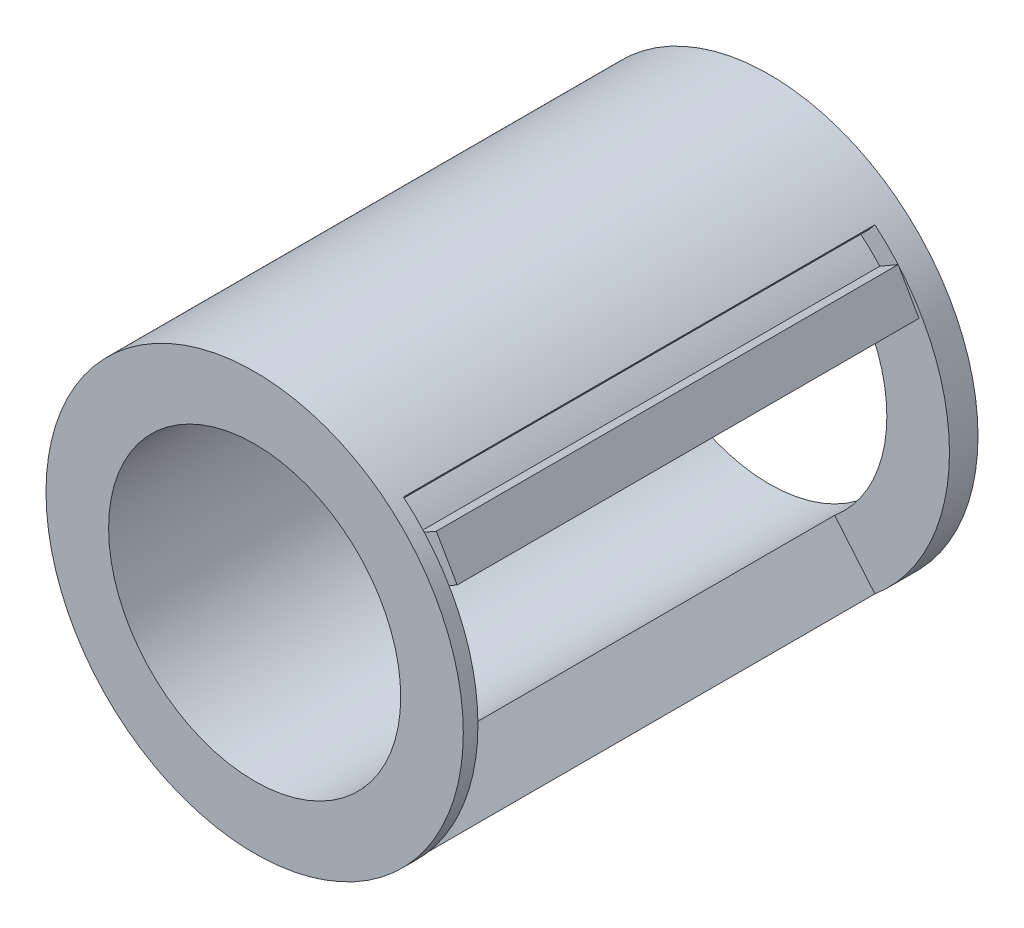
ISO-10303-21;
HEADER;
FILE_DESCRIPTION(('STEP AP214'),'2;1');
FILE_NAME('part.step','',(''),(''),'','','');
FILE_SCHEMA(('AUTOMOTIVE_DESIGN { 1 0 10303 214 1 1 1 1 }'));
ENDSEC;
DATA;
#1=APPLICATION_CONTEXT('core data for automotive mechanical design processes');
#2=APPLICATION_PROTOCOL_DEFINITION('international standard','automotive_design',2000,#1);
#3=PRODUCT_CONTEXT('',#1,'mechanical');
#4=PRODUCT('Part','Part','',(#3));
#5=PRODUCT_RELATED_PRODUCT_CATEGORY('part','',(#4));
#6=PRODUCT_DEFINITION_FORMATION('','',#4);
#7=PRODUCT_DEFINITION_CONTEXT('part definition',#1,'design');
#8=PRODUCT_DEFINITION('design','',#6,#7);
#9=PRODUCT_DEFINITION_SHAPE('','',#8);
#10=(LENGTH_UNIT() NAMED_UNIT(*) SI_UNIT(.MILLI.,.METRE.));
#11=(NAMED_UNIT(*) PLANE_ANGLE_UNIT() SI_UNIT($,.RADIAN.));
#12=(NAMED_UNIT(*) SI_UNIT($,.STERADIAN.) SOLID_ANGLE_UNIT());
#13=UNCERTAINTY_MEASURE_WITH_UNIT(LENGTH_MEASURE(1.E-05),#10,'distance_accuracy_value','');
#14=(GEOMETRIC_REPRESENTATION_CONTEXT(3) GLOBAL_UNCERTAINTY_ASSIGNED_CONTEXT((#13)) GLOBAL_UNIT_ASSIGNED_CONTEXT((#10,
#11,#12)) REPRESENTATION_CONTEXT('',''));
#15=CARTESIAN_POINT('',(0.,0.,0.));
#16=DIRECTION('',(0.,0.,1.));
#17=DIRECTION('',(1.,0.,0.));
#18=AXIS2_PLACEMENT_3D('',#15,#16,#17);
#19=CARTESIAN_POINT('',(0.,0.,100.));
#20=DIRECTION('',(0.,0.,1.));
#21=DIRECTION('',(1.,0.,0.));
#22=AXIS2_PLACEMENT_3D('',#19,#20,#21);
#23=CYLINDRICAL_SURFACE('',#22,14.);
#24=DIRECTION('',(0.,0.,1.));
#25=VECTOR('',#24,1.);
#26=CARTESIAN_POINT('',(10.3427192823264,9.43547337694269,100.));
#27=LINE('',#26,#25);
#28=CARTESIAN_POINT('',(10.3427192823266,9.43547337694242,59.4));
#29=VERTEX_POINT('',#28);
#30=CARTESIAN_POINT('',(10.3427192823264,9.43547337694264,92.6));
#31=VERTEX_POINT('',#30);
#32=EDGE_CURVE('E129',#29,#31,#27,.T.);
#33=ORIENTED_EDGE('',*,*,#32,.F.);
#34=CARTESIAN_POINT('',(0.,0.,59.4));
#35=DIRECTION('',(0.,0.,1.));
#36=DIRECTION('',(1.,0.,0.));
#37=AXIS2_PLACEMENT_3D('',#34,#35,#36);
#38=CIRCLE('',#37,14.);
#39=CARTESIAN_POINT('',(-10.7246222036657,8.9990265356115,59.4));
#40=VERTEX_POINT('',#39);
#41=EDGE_CURVE('E146',#29,#40,#38,.T.);
#42=ORIENTED_EDGE('',*,*,#41,.T.);
#43=DIRECTION('',(0.,0.,-1.));
#44=VECTOR('',#43,1.);
#45=CARTESIAN_POINT('',(-10.7246222036657,8.9990265356115,92.6));
#46=LINE('',#45,#44);
#47=CARTESIAN_POINT('',(-10.7246222036657,8.9990265356115,92.6));
#48=VERTEX_POINT('',#47);
#49=EDGE_CURVE('E132',#48,#40,#46,.T.);
#50=ORIENTED_EDGE('',*,*,#49,.F.);
#51=CARTESIAN_POINT('',(0.,0.,92.6));
#52=DIRECTION('',(0.,0.,1.));
#53=DIRECTION('',(1.,0.,0.));
#54=AXIS2_PLACEMENT_3D('',#51,#52,#53);
#55=CIRCLE('',#54,14.);
#56=EDGE_CURVE('E13',#31,#48,#55,.T.);
#57=ORIENTED_EDGE('',*,*,#56,.F.);
#58=EDGE_LOOP('',(#33,#42,#50,#57));
#59=FACE_BOUND('',#58,.T.);
#60=ADVANCED_FACE('F47',(#59),#23,.T.);
#61=CARTESIAN_POINT('',(9.95929214352105,5.75000000000002,92.6));
#62=DIRECTION('',(0.,0.,1.));
#63=DIRECTION('',(1.,0.,0.));
#64=AXIS2_PLACEMENT_3D('',#61,#62,#63);
#65=PLANE('',#64);
#66=DIRECTION('',(0.866025403784438,0.500000000000001,0.));
#67=VECTOR('',#66,1.);
#68=CARTESIAN_POINT('',(9.95929214352105,5.75000000000002,92.6));
#69=LINE('',#68,#67);
#70=CARTESIAN_POINT('',(9.95929214352105,5.75000000000002,92.6));
#71=VERTEX_POINT('',#70);
#72=CARTESIAN_POINT('',(13.1601838053704,7.59803566261557,92.6));
#73=VERTEX_POINT('',#72);
#74=EDGE_CURVE('E144',#71,#73,#69,.T.);
#75=ORIENTED_EDGE('',*,*,#74,.T.);
#76=DIRECTION('',(0.500000000000001,-0.866025403784438,0.));
#77=VECTOR('',#76,1.);
#78=CARTESIAN_POINT('',(13.1601838053704,7.59803566261557,92.6));
#79=LINE('',#78,#77);
#80=CARTESIAN_POINT('',(11.66018380537,10.1961118739696,92.6));
#81=VERTEX_POINT('',#80);
#82=EDGE_CURVE('E122',#81,#73,#79,.T.);
#83=ORIENTED_EDGE('',*,*,#82,.F.);
#84=DIRECTION('',(0.866025403784438,0.500000000000001,0.));
#85=VECTOR('',#84,1.);
#86=CARTESIAN_POINT('',(9.06210759401665,8.69611187396961,92.6));
#87=LINE('',#86,#85);
#88=EDGE_CURVE('E127',#31,#81,#87,.T.);
#89=ORIENTED_EDGE('',*,*,#88,.F.);
#90=ORIENTED_EDGE('',*,*,#56,.T.);
#91=DIRECTION('',(-0.766044443118981,0.642787609686536,0.));
#92=VECTOR('',#91,1.);
#93=CARTESIAN_POINT('',(-8.80951109586829,7.39205751139516,92.6));
#94=LINE('',#93,#92);
#95=CARTESIAN_POINT('',(-8.80951109586829,7.39205751139516,92.6));
#96=VERTEX_POINT('',#95);
#97=EDGE_CURVE('E107',#96,#48,#94,.T.);
#98=ORIENTED_EDGE('',*,*,#97,.F.);
#99=CARTESIAN_POINT('',(0.,0.,92.6));
#100=DIRECTION('',(0.,0.,1.));
#101=DIRECTION('',(1.,0.,0.));
#102=AXIS2_PLACEMENT_3D('',#99,#100,#101);
#103=CIRCLE('',#102,11.5);
#104=EDGE_CURVE('E55',#71,#96,#103,.T.);
#105=ORIENTED_EDGE('',*,*,#104,.F.);
#106=EDGE_LOOP('',(#75,#83,#89,#90,#98,#105));
#107=FACE_BOUND('',#106,.T.);
#108=ADVANCED_FACE('F49',(#107),#65,.T.);
#109=CARTESIAN_POINT('',(0.,0.,100.));
#110=DIRECTION('',(0.,0.,1.));
#111=DIRECTION('',(1.,0.,0.));
#112=AXIS2_PLACEMENT_3D('',#109,#110,#111);
#113=CYLINDRICAL_SURFACE('',#112,11.5);
#114=CARTESIAN_POINT('',(0.,0.,59.4));
#115=DIRECTION('',(0.,0.,1.));
#116=DIRECTION('',(1.,0.,0.));
#117=AXIS2_PLACEMENT_3D('',#114,#115,#116);
#118=CIRCLE('',#117,11.5);
#119=CARTESIAN_POINT('',(9.95929214352105,5.75000000000002,59.4));
#120=VERTEX_POINT('',#119);
#121=CARTESIAN_POINT('',(-8.80951109586829,7.39205751139516,59.4));
#122=VERTEX_POINT('',#121);
#123=EDGE_CURVE('E148',#120,#122,#118,.T.);
#124=ORIENTED_EDGE('',*,*,#123,.F.);
#125=DIRECTION('',(0.,0.,-1.));
#126=VECTOR('',#125,1.);
#127=CARTESIAN_POINT('',(9.95929214352105,5.75000000000002,92.6));
#128=LINE('',#127,#126);
#129=EDGE_CURVE('E105',#71,#120,#128,.T.);
#130=ORIENTED_EDGE('',*,*,#129,.F.);
#131=ORIENTED_EDGE('',*,*,#104,.T.);
#132=DIRECTION('',(0.,0.,-1.));
#133=VECTOR('',#132,1.);
#134=CARTESIAN_POINT('',(-8.80951109586829,7.39205751139516,92.6));
#135=LINE('',#134,#133);
#136=EDGE_CURVE('E138',#96,#122,#135,.T.);
#137=ORIENTED_EDGE('',*,*,#136,.T.);
#138=EDGE_LOOP('',(#124,#130,#131,#137));
#139=FACE_BOUND('',#138,.T.);
#140=ADVANCED_FACE('F151',(#139),#113,.F.);
#141=CARTESIAN_POINT('',(9.95929214352105,5.75000000000002,59.4));
#142=DIRECTION('',(0.,0.,1.));
#143=DIRECTION('',(1.,0.,0.));
#144=AXIS2_PLACEMENT_3D('',#141,#142,#143);
#145=PLANE('',#144);
#146=ORIENTED_EDGE('',*,*,#41,.F.);
#147=DIRECTION('',(0.866025403784438,0.500000000000001,0.));
#148=VECTOR('',#147,1.);
#149=CARTESIAN_POINT('',(9.06210759401685,8.69611187396938,59.4));
#150=LINE('',#149,#148);
#151=CARTESIAN_POINT('',(11.6601838053702,10.1961118739694,59.4));
#152=VERTEX_POINT('',#151);
#153=EDGE_CURVE('E113',#29,#152,#150,.T.);
#154=ORIENTED_EDGE('',*,*,#153,.T.);
#155=DIRECTION('',(-0.500000000000001,0.866025403784438,0.));
#156=VECTOR('',#155,1.);
#157=CARTESIAN_POINT('',(13.1601838053706,7.59803566261534,59.4000000000001));
#158=LINE('',#157,#156);
#159=CARTESIAN_POINT('',(13.1601838053706,7.59803566261534,59.4000000000001));
#160=VERTEX_POINT('',#159);
#161=EDGE_CURVE('E110',#160,#152,#158,.T.);
#162=ORIENTED_EDGE('',*,*,#161,.F.);
#163=DIRECTION('',(0.866025403784438,0.500000000000001,0.));
#164=VECTOR('',#163,1.);
#165=CARTESIAN_POINT('',(9.95929214352105,5.75000000000002,59.4));
#166=LINE('',#165,#164);
#167=EDGE_CURVE('E99',#120,#160,#166,.T.);
#168=ORIENTED_EDGE('',*,*,#167,.F.);
#169=ORIENTED_EDGE('',*,*,#123,.T.);
#170=DIRECTION('',(-0.766044443118981,0.642787609686536,0.));
#171=VECTOR('',#170,1.);
#172=CARTESIAN_POINT('',(-8.80951109586829,7.39205751139516,59.4));
#173=LINE('',#172,#171);
#174=EDGE_CURVE('E135',#122,#40,#173,.T.);
#175=ORIENTED_EDGE('',*,*,#174,.T.);
#176=EDGE_LOOP('',(#146,#154,#162,#168,#169,#175));
#177=FACE_BOUND('',#176,.T.);
#178=ADVANCED_FACE('F111',(#177),#145,.F.);
#179=CARTESIAN_POINT('',(0.,0.,0.));
#180=DIRECTION('',(0.500000000000001,-0.866025403784438,0.));
#181=DIRECTION('',(0.866025403784438,0.500000000000001,0.));
#182=AXIS2_PLACEMENT_3D('',#179,#180,#181);
#183=PLANE('',#182);
#184=DIRECTION('',(0.,0.,-1.));
#185=VECTOR('',#184,1.);
#186=CARTESIAN_POINT('',(13.1601838053704,7.59803566261557,92.6));
#187=LINE('',#186,#185);
#188=EDGE_CURVE('E104',#73,#160,#187,.T.);
#189=ORIENTED_EDGE('',*,*,#188,.F.);
#190=ORIENTED_EDGE('',*,*,#74,.F.);
#191=ORIENTED_EDGE('',*,*,#129,.T.);
#192=ORIENTED_EDGE('',*,*,#167,.T.);
#193=EDGE_LOOP('',(#189,#190,#191,#192));
#194=FACE_BOUND('',#193,.T.);
#195=ADVANCED_FACE('F101',(#194),#183,.T.);
#196=CARTESIAN_POINT('',(0.,0.,0.));
#197=DIRECTION('',(0.642787609686536,0.766044443118981,0.));
#198=DIRECTION('',(-0.766044443118981,0.642787609686536,0.));
#199=AXIS2_PLACEMENT_3D('',#196,#197,#198);
#200=PLANE('',#199);
#201=ORIENTED_EDGE('',*,*,#49,.T.);
#202=ORIENTED_EDGE('',*,*,#174,.F.);
#203=ORIENTED_EDGE('',*,*,#136,.F.);
#204=ORIENTED_EDGE('',*,*,#97,.T.);
#205=EDGE_LOOP('',(#201,#202,#203,#204));
#206=FACE_BOUND('',#205,.T.);
#207=ADVANCED_FACE('F154',(#206),#200,.F.);
#208=CARTESIAN_POINT('',(9.06210759401665,8.69611187396961,92.6));
#209=DIRECTION('',(-0.500000000000001,0.866025403784438,0.));
#210=DIRECTION('',(-0.866025403784438,-0.500000000000001,0.));
#211=AXIS2_PLACEMENT_3D('',#208,#209,#210);
#212=PLANE('',#211);
#213=ORIENTED_EDGE('',*,*,#153,.F.);
#214=ORIENTED_EDGE('',*,*,#32,.T.);
#215=ORIENTED_EDGE('',*,*,#88,.T.);
#216=DIRECTION('',(0.,0.,1.));
#217=VECTOR('',#216,1.);
#218=CARTESIAN_POINT('',(11.66018380537,10.1961118739696,92.6));
#219=LINE('',#218,#217);
#220=EDGE_CURVE('E117',#152,#81,#219,.T.);
#221=ORIENTED_EDGE('',*,*,#220,.F.);
#222=EDGE_LOOP('',(#213,#214,#215,#221));
#223=FACE_BOUND('',#222,.T.);
#224=ADVANCED_FACE('F157',(#223),#212,.T.);
#225=CARTESIAN_POINT('',(13.1601838053705,7.59803566261565,0.));
#226=DIRECTION('',(0.866025403784438,0.500000000000001,0.));
#227=DIRECTION('',(-0.500000000000001,0.866025403784438,0.));
#228=AXIS2_PLACEMENT_3D('',#225,#226,#227);
#229=PLANE('',#228);
#230=ORIENTED_EDGE('',*,*,#188,.T.);
#231=ORIENTED_EDGE('',*,*,#161,.T.);
#232=ORIENTED_EDGE('',*,*,#220,.T.);
#233=ORIENTED_EDGE('',*,*,#82,.T.);
#234=EDGE_LOOP('',(#230,#231,#232,#233));
#235=FACE_BOUND('',#234,.T.);
#236=ADVANCED_FACE('F120',(#235),#229,.T.);
#237=CLOSED_SHELL('',(#60,#108,#140,#178,#195,#207,#224,#236));
#238=MANIFOLD_SOLID_BREP('B2',#237);
#239=CARTESIAN_POINT('',(0.,0.,100.));
#240=DIRECTION('',(0.,0.,-1.));
#241=DIRECTION('',(-1.,0.,0.));
#242=AXIS2_PLACEMENT_3D('',#239,#240,#241);
#243=CYLINDRICAL_SURFACE('',#242,10.5);
#244=CARTESIAN_POINT('',(0.,0.,92.9473085544837));
#245=DIRECTION('',(0.,0.,1.));
#246=DIRECTION('',(1.,0.,0.));
#247=AXIS2_PLACEMENT_3D('',#244,#245,#246);
#248=CIRCLE('',#247,10.5);
#249=CARTESIAN_POINT('',(6.74926990170864,-8.04346665274929,92.9473085544837));
#250=VERTEX_POINT('',#249);
#251=CARTESIAN_POINT('',(6.74926990170864,8.04346665274928,92.9473085544837));
#252=VERTEX_POINT('',#251);
#253=EDGE_CURVE('E45',#250,#252,#248,.T.);
#254=ORIENTED_EDGE('',*,*,#253,.F.);
#255=DIRECTION('',(0.,0.,-1.));
#256=VECTOR('',#255,1.);
#257=CARTESIAN_POINT('',(6.74926990170866,-8.04346665274928,123.358594748266));
#258=LINE('',#257,#256);
#259=CARTESIAN_POINT('',(6.74926990170864,-8.04346665274929,59.0526914455163));
#260=VERTEX_POINT('',#259);
#261=EDGE_CURVE('E350',#250,#260,#258,.T.);
#262=ORIENTED_EDGE('',*,*,#261,.T.);
#263=CARTESIAN_POINT('',(0.,0.,59.0526914455163));
#264=DIRECTION('',(0.,0.,-1.));
#265=DIRECTION('',(-1.,0.,0.));
#266=AXIS2_PLACEMENT_3D('',#263,#264,#265);
#267=CIRCLE('',#266,10.5);
#268=CARTESIAN_POINT('',(6.74926990170864,8.04346665274928,59.0526914455163));
#269=VERTEX_POINT('',#268);
#270=EDGE_CURVE('E241',#269,#260,#267,.T.);
#271=ORIENTED_EDGE('',*,*,#270,.F.);
#272=DIRECTION('',(0.,0.,-1.));
#273=VECTOR('',#272,1.);
#274=CARTESIAN_POINT('',(6.74926990170864,8.04346665274928,123.358594748266));
#275=LINE('',#274,#273);
#276=EDGE_CURVE('E353',#252,#269,#275,.T.);
#277=ORIENTED_EDGE('',*,*,#276,.F.);
#278=EDGE_LOOP('',(#254,#262,#271,#277));
#279=FACE_BOUND('',#278,.T.);
#280=CARTESIAN_POINT('',(0.,0.,57.));
#281=DIRECTION('',(0.,0.,1.));
#282=DIRECTION('',(1.,0.,0.));
#283=AXIS2_PLACEMENT_3D('',#280,#281,#282);
#284=CIRCLE('',#283,10.5);
#285=CARTESIAN_POINT('',(10.5,0.,57.));
#286=VERTEX_POINT('',#285);
#287=EDGE_CURVE('E318',#286,#286,#284,.T.);
#288=ORIENTED_EDGE('',*,*,#287,.F.);
#289=EDGE_LOOP('',(#288));
#290=FACE_BOUND('',#289,.T.);
#291=CARTESIAN_POINT('',(0.,0.,94.));
#292=DIRECTION('',(0.,0.,1.));
#293=DIRECTION('',(1.,0.,0.));
#294=AXIS2_PLACEMENT_3D('',#291,#292,#293);
#295=CIRCLE('',#294,10.5);
#296=CARTESIAN_POINT('',(10.5,0.,94.));
#297=VERTEX_POINT('',#296);
#298=EDGE_CURVE('E375',#297,#297,#295,.T.);
#299=ORIENTED_EDGE('',*,*,#298,.T.);
#300=EDGE_LOOP('',(#299));
#301=FACE_BOUND('',#300,.T.);
#302=ADVANCED_FACE('F232',(#279,#290,#301),#243,.F.);
#303=CARTESIAN_POINT('',(0.,0.,100.));
#304=DIRECTION('',(0.,0.,-1.));
#305=DIRECTION('',(-1.,0.,0.));
#306=AXIS2_PLACEMENT_3D('',#303,#304,#305);
#307=CYLINDRICAL_SURFACE('',#306,15.);
#308=DIRECTION('',(0.,0.,-1.));
#309=VECTOR('',#308,1.);
#310=CARTESIAN_POINT('',(9.64181414529807,-11.4906666467847,100.));
#311=LINE('',#310,#309);
#312=CARTESIAN_POINT('',(9.64181414529807,-11.4906666467847,92.9473085544837));
#313=VERTEX_POINT('',#312);
#314=CARTESIAN_POINT('',(9.64181414529807,-11.4906666467847,59.0526914455163));
#315=VERTEX_POINT('',#314);
#316=EDGE_CURVE('E336',#313,#315,#311,.T.);
#317=ORIENTED_EDGE('',*,*,#316,.F.);
#318=CARTESIAN_POINT('',(0.,0.,92.9473085544837));
#319=DIRECTION('',(0.,0.,1.));
#320=DIRECTION('',(1.,0.,0.));
#321=AXIS2_PLACEMENT_3D('',#318,#319,#320);
#322=CIRCLE('',#321,15.);
#323=CARTESIAN_POINT('',(9.64181414529807,11.4906666467847,92.9473085544837));
#324=VERTEX_POINT('',#323);
#325=EDGE_CURVE('E339',#313,#324,#322,.T.);
#326=ORIENTED_EDGE('',*,*,#325,.T.);
#327=DIRECTION('',(0.,0.,-1.));
#328=VECTOR('',#327,1.);
#329=CARTESIAN_POINT('',(9.64181414529807,11.4906666467847,100.));
#330=LINE('',#329,#328);
#331=CARTESIAN_POINT('',(9.64181414529807,11.4906666467847,59.0526914455163));
#332=VERTEX_POINT('',#331);
#333=EDGE_CURVE('E334',#324,#332,#330,.T.);
#334=ORIENTED_EDGE('',*,*,#333,.T.);
#335=CARTESIAN_POINT('',(0.,0.,59.0526914455163));
#336=DIRECTION('',(0.,0.,-1.));
#337=DIRECTION('',(-1.,0.,0.));
#338=AXIS2_PLACEMENT_3D('',#335,#336,#337);
#339=CIRCLE('',#338,15.);
#340=EDGE_CURVE('E323',#332,#315,#339,.T.);
#341=ORIENTED_EDGE('',*,*,#340,.T.);
#342=EDGE_LOOP('',(#317,#326,#334,#341));
#343=FACE_BOUND('',#342,.T.);
#344=CARTESIAN_POINT('',(0.,0.,57.));
#345=DIRECTION('',(0.,0.,1.));
#346=DIRECTION('',(1.,0.,0.));
#347=AXIS2_PLACEMENT_3D('',#344,#345,#346);
#348=CIRCLE('',#347,15.);
#349=CARTESIAN_POINT('',(15.,0.,57.));
#350=VERTEX_POINT('',#349);
#351=EDGE_CURVE('E372',#350,#350,#348,.T.);
#352=ORIENTED_EDGE('',*,*,#351,.T.);
#353=EDGE_LOOP('',(#352));
#354=FACE_BOUND('',#353,.T.);
#355=CARTESIAN_POINT('',(0.,0.,94.));
#356=DIRECTION('',(0.,0.,1.));
#357=DIRECTION('',(1.,0.,0.));
#358=AXIS2_PLACEMENT_3D('',#355,#356,#357);
#359=CIRCLE('',#358,15.);
#360=CARTESIAN_POINT('',(15.,0.,94.));
#361=VERTEX_POINT('',#360);
#362=EDGE_CURVE('E236',#361,#361,#359,.T.);
#363=ORIENTED_EDGE('',*,*,#362,.F.);
#364=EDGE_LOOP('',(#363));
#365=FACE_BOUND('',#364,.T.);
#366=ADVANCED_FACE('F234',(#343,#354,#365),#307,.T.);
#367=CARTESIAN_POINT('',(0.,0.,0.));
#368=DIRECTION('',(-0.766044443118979,0.642787609686538,0.));
#369=DIRECTION('',(0.,0.,1.));
#370=AXIS2_PLACEMENT_3D('',#367,#368,#369);
#371=PLANE('',#370);
#372=DIRECTION('',(0.,0.,-1.));
#373=VECTOR('',#372,1.);
#374=CARTESIAN_POINT('',(9.19941541208372,10.9634363671174,92.9473085544837));
#375=LINE('',#374,#373);
#376=CARTESIAN_POINT('',(9.19941541208372,10.9634363671174,92.9473085544837));
#377=VERTEX_POINT('',#376);
#378=CARTESIAN_POINT('',(9.19941541208372,10.9634363671174,59.0526914455163));
#379=VERTEX_POINT('',#378);
#380=EDGE_CURVE('E301',#377,#379,#375,.T.);
#381=ORIENTED_EDGE('',*,*,#380,.T.);
#382=DIRECTION('',(-0.642787609686538,-0.766044443118979,0.));
#383=VECTOR('',#382,1.);
#384=CARTESIAN_POINT('',(13.9595466381269,16.6363398569743,59.0526914455163));
#385=LINE('',#384,#383);
#386=EDGE_CURVE('E315',#332,#379,#385,.T.);
#387=ORIENTED_EDGE('',*,*,#386,.F.);
#388=ORIENTED_EDGE('',*,*,#333,.F.);
#389=DIRECTION('',(0.642787609686538,0.766044443118979,0.));
#390=VECTOR('',#389,1.);
#391=CARTESIAN_POINT('',(13.9595466381269,16.6363398569743,92.9473085544837));
#392=LINE('',#391,#390);
#393=EDGE_CURVE('E317',#377,#324,#392,.T.);
#394=ORIENTED_EDGE('',*,*,#393,.F.);
#395=EDGE_LOOP('',(#381,#387,#388,#394));
#396=FACE_BOUND('',#395,.T.);
#397=ADVANCED_FACE('F313',(#396),#371,.F.);
#398=CARTESIAN_POINT('',(13.9595466381269,-16.6363398569743,92.9473085544837));
#399=DIRECTION('',(0.,0.,1.));
#400=DIRECTION('',(1.,0.,0.));
#401=AXIS2_PLACEMENT_3D('',#398,#399,#400);
#402=PLANE('',#401);
#403=ORIENTED_EDGE('',*,*,#253,.T.);
#404=CARTESIAN_POINT('',(7.191668634923,8.57069693241662,92.9473085544837));
#405=VERTEX_POINT('',#404);
#406=EDGE_CURVE('E329',#252,#405,#392,.T.);
#407=ORIENTED_EDGE('',*,*,#406,.T.);
#408=CARTESIAN_POINT('',(0.,0.,92.9473085544837));
#409=DIRECTION('',(0.,0.,-1.));
#410=DIRECTION('',(-1.,0.,0.));
#411=AXIS2_PLACEMENT_3D('',#408,#409,#410);
#412=CIRCLE('',#411,11.1882502502344);
#413=CARTESIAN_POINT('',(-9.68930894060065,5.59412512511716,92.9473085544837));
#414=VERTEX_POINT('',#413);
#415=EDGE_CURVE('E358',#414,#405,#412,.T.);
#416=ORIENTED_EDGE('',*,*,#415,.F.);
#417=DIRECTION('',(-0.866025403784441,0.499999999999996,0.));
#418=VECTOR('',#417,1.);
#419=CARTESIAN_POINT('',(-9.68930894060065,5.59412512511716,92.9473085544837));
#420=LINE('',#419,#418);
#421=CARTESIAN_POINT('',(-12.3943388559026,7.15587487488272,92.9473085544837));
#422=VERTEX_POINT('',#421);
#423=EDGE_CURVE('E310',#414,#422,#420,.T.);
#424=ORIENTED_EDGE('',*,*,#423,.T.);
#425=CARTESIAN_POINT('',(0.,0.,92.9473085544837));
#426=DIRECTION('',(0.,0.,-1.));
#427=DIRECTION('',(-1.,0.,0.));
#428=AXIS2_PLACEMENT_3D('',#425,#426,#427);
#429=CIRCLE('',#428,14.3117497497656);
#430=EDGE_CURVE('E355',#422,#377,#429,.T.);
#431=ORIENTED_EDGE('',*,*,#430,.T.);
#432=ORIENTED_EDGE('',*,*,#393,.T.);
#433=ORIENTED_EDGE('',*,*,#325,.F.);
#434=DIRECTION('',(0.642787609686538,-0.766044443118979,0.));
#435=VECTOR('',#434,1.);
#436=CARTESIAN_POINT('',(13.9595466381269,-16.6363398569743,92.9473085544837));
#437=LINE('',#436,#435);
#438=EDGE_CURVE('E255',#250,#313,#437,.T.);
#439=ORIENTED_EDGE('',*,*,#438,.F.);
#440=EDGE_LOOP('',(#403,#407,#416,#424,#431,#432,#433,#439));
#441=FACE_BOUND('',#440,.T.);
#442=ADVANCED_FACE('F391',(#441),#402,.F.);
#443=CARTESIAN_POINT('',(13.9595466381269,-16.6363398569743,59.0526914455163));
#444=DIRECTION('',(0.,0.,-1.));
#445=DIRECTION('',(-1.,0.,0.));
#446=AXIS2_PLACEMENT_3D('',#443,#444,#445);
#447=PLANE('',#446);
#448=ORIENTED_EDGE('',*,*,#386,.T.);
#449=CARTESIAN_POINT('',(0.,0.,59.0526914455163));
#450=DIRECTION('',(0.,0.,-1.));
#451=DIRECTION('',(-1.,0.,0.));
#452=AXIS2_PLACEMENT_3D('',#449,#450,#451);
#453=CIRCLE('',#452,14.3117497497656);
#454=CARTESIAN_POINT('',(-12.3943388559026,7.15587487488272,59.0526914455163));
#455=VERTEX_POINT('',#454);
#456=EDGE_CURVE('E298',#455,#379,#453,.T.);
#457=ORIENTED_EDGE('',*,*,#456,.F.);
#458=DIRECTION('',(-0.866025403784441,0.499999999999996,0.));
#459=VECTOR('',#458,1.);
#460=CARTESIAN_POINT('',(-9.68930894060065,5.59412512511716,59.0526914455163));
#461=LINE('',#460,#459);
#462=CARTESIAN_POINT('',(-9.68930894060065,5.59412512511716,59.0526914455163));
#463=VERTEX_POINT('',#462);
#464=EDGE_CURVE('E366',#463,#455,#461,.T.);
#465=ORIENTED_EDGE('',*,*,#464,.F.);
#466=CARTESIAN_POINT('',(0.,0.,59.0526914455163));
#467=DIRECTION('',(0.,0.,-1.));
#468=DIRECTION('',(-1.,0.,0.));
#469=AXIS2_PLACEMENT_3D('',#466,#467,#468);
#470=CIRCLE('',#469,11.1882502502344);
#471=CARTESIAN_POINT('',(7.191668634923,8.57069693241662,59.0526914455163));
#472=VERTEX_POINT('',#471);
#473=EDGE_CURVE('E309',#463,#472,#470,.T.);
#474=ORIENTED_EDGE('',*,*,#473,.T.);
#475=EDGE_CURVE('E325',#472,#269,#385,.T.);
#476=ORIENTED_EDGE('',*,*,#475,.T.);
#477=ORIENTED_EDGE('',*,*,#270,.T.);
#478=DIRECTION('',(-0.642787609686538,0.766044443118979,0.));
#479=VECTOR('',#478,1.);
#480=CARTESIAN_POINT('',(13.9595466381269,-16.6363398569743,59.0526914455163));
#481=LINE('',#480,#479);
#482=EDGE_CURVE('E327',#315,#260,#481,.T.);
#483=ORIENTED_EDGE('',*,*,#482,.F.);
#484=ORIENTED_EDGE('',*,*,#340,.F.);
#485=EDGE_LOOP('',(#448,#457,#465,#474,#476,#477,#483,#484));
#486=FACE_BOUND('',#485,.T.);
#487=ADVANCED_FACE('F320',(#486),#447,.F.);
#488=CARTESIAN_POINT('',(0.,0.,0.));
#489=DIRECTION('',(0.766044443118979,0.642787609686538,0.));
#490=DIRECTION('',(0.,0.,1.));
#491=AXIS2_PLACEMENT_3D('',#488,#489,#490);
#492=PLANE('',#491);
#493=ORIENTED_EDGE('',*,*,#482,.T.);
#494=ORIENTED_EDGE('',*,*,#261,.F.);
#495=ORIENTED_EDGE('',*,*,#438,.T.);
#496=ORIENTED_EDGE('',*,*,#316,.T.);
#497=EDGE_LOOP('',(#493,#494,#495,#496));
#498=FACE_BOUND('',#497,.T.);
#499=ADVANCED_FACE('F419',(#498),#492,.T.);
#500=ORIENTED_EDGE('',*,*,#475,.F.);
#501=DIRECTION('',(0.,0.,-1.));
#502=VECTOR('',#501,1.);
#503=CARTESIAN_POINT('',(7.191668634923,8.57069693241662,92.9473085544837));
#504=LINE('',#503,#502);
#505=EDGE_CURVE('E248',#405,#472,#504,.T.);
#506=ORIENTED_EDGE('',*,*,#505,.F.);
#507=ORIENTED_EDGE('',*,*,#406,.F.);
#508=ORIENTED_EDGE('',*,*,#276,.T.);
#509=EDGE_LOOP('',(#500,#506,#507,#508));
#510=FACE_BOUND('',#509,.T.);
#511=ADVANCED_FACE('F393',(#510),#371,.F.);
#512=CARTESIAN_POINT('',(0.,0.,100.));
#513=DIRECTION('',(0.,0.,-1.));
#514=DIRECTION('',(-1.,0.,0.));
#515=AXIS2_PLACEMENT_3D('',#512,#513,#514);
#516=CYLINDRICAL_SURFACE('',#515,14.3117497497656);
#517=ORIENTED_EDGE('',*,*,#430,.F.);
#518=DIRECTION('',(0.,0.,-1.));
#519=VECTOR('',#518,1.);
#520=CARTESIAN_POINT('',(-12.3943388559026,7.15587487488272,92.9473085544837));
#521=LINE('',#520,#519);
#522=EDGE_CURVE('E304',#422,#455,#521,.T.);
#523=ORIENTED_EDGE('',*,*,#522,.T.);
#524=ORIENTED_EDGE('',*,*,#456,.T.);
#525=ORIENTED_EDGE('',*,*,#380,.F.);
#526=EDGE_LOOP('',(#517,#523,#524,#525));
#527=FACE_BOUND('',#526,.T.);
#528=ADVANCED_FACE('F300',(#527),#516,.F.);
#529=CARTESIAN_POINT('',(0.,0.,100.));
#530=DIRECTION('',(0.,0.,-1.));
#531=DIRECTION('',(-1.,0.,0.));
#532=AXIS2_PLACEMENT_3D('',#529,#530,#531);
#533=CYLINDRICAL_SURFACE('',#532,11.1882502502344);
#534=ORIENTED_EDGE('',*,*,#473,.F.);
#535=DIRECTION('',(0.,0.,-1.));
#536=VECTOR('',#535,1.);
#537=CARTESIAN_POINT('',(-9.68930894060065,5.59412512511716,92.9473085544837));
#538=LINE('',#537,#536);
#539=EDGE_CURVE('E363',#414,#463,#538,.T.);
#540=ORIENTED_EDGE('',*,*,#539,.F.);
#541=ORIENTED_EDGE('',*,*,#415,.T.);
#542=ORIENTED_EDGE('',*,*,#505,.T.);
#543=EDGE_LOOP('',(#534,#540,#541,#542));
#544=FACE_BOUND('',#543,.T.);
#545=ADVANCED_FACE('F410',(#544),#533,.T.);
#546=CARTESIAN_POINT('',(0.,0.,0.));
#547=DIRECTION('',(0.499999999999996,0.866025403784441,0.));
#548=DIRECTION('',(-0.866025403784441,0.499999999999996,0.));
#549=AXIS2_PLACEMENT_3D('',#546,#547,#548);
#550=PLANE('',#549);
#551=ORIENTED_EDGE('',*,*,#522,.F.);
#552=ORIENTED_EDGE('',*,*,#423,.F.);
#553=ORIENTED_EDGE('',*,*,#539,.T.);
#554=ORIENTED_EDGE('',*,*,#464,.T.);
#555=EDGE_LOOP('',(#551,#552,#553,#554));
#556=FACE_BOUND('',#555,.T.);
#557=ADVANCED_FACE('F400',(#556),#550,.T.);
#558=CARTESIAN_POINT('',(0.,0.,57.));
#559=DIRECTION('',(0.,0.,1.));
#560=DIRECTION('',(1.,0.,0.));
#561=AXIS2_PLACEMENT_3D('',#558,#559,#560);
#562=PLANE('',#561);
#563=ORIENTED_EDGE('',*,*,#287,.T.);
#564=EDGE_LOOP('',(#563));
#565=FACE_BOUND('',#564,.T.);
#566=ORIENTED_EDGE('',*,*,#351,.F.);
#567=EDGE_LOOP('',(#566));
#568=FACE_BOUND('',#567,.T.);
#569=ADVANCED_FACE('F398',(#565,#568),#562,.F.);
#570=CARTESIAN_POINT('',(0.,0.,94.));
#571=DIRECTION('',(0.,0.,1.));
#572=DIRECTION('',(1.,0.,0.));
#573=AXIS2_PLACEMENT_3D('',#570,#571,#572);
#574=PLANE('',#573);
#575=ORIENTED_EDGE('',*,*,#298,.F.);
#576=EDGE_LOOP('',(#575));
#577=FACE_BOUND('',#576,.T.);
#578=ORIENTED_EDGE('',*,*,#362,.T.);
#579=EDGE_LOOP('',(#578));
#580=FACE_BOUND('',#579,.T.);
#581=ADVANCED_FACE('F382',(#577,#580),#574,.T.);
#582=CLOSED_SHELL('',(#302,#366,#397,#442,#487,#499,#511,#528,#545,#557,#569,#581));
#583=MANIFOLD_SOLID_BREP('B7',#582);
#584=ADVANCED_BREP_SHAPE_REPRESENTATION('',(#18,#238,#583),#14);
#585=SHAPE_DEFINITION_REPRESENTATION(#9,#584);
ENDSEC;
END-ISO-10303-21;
